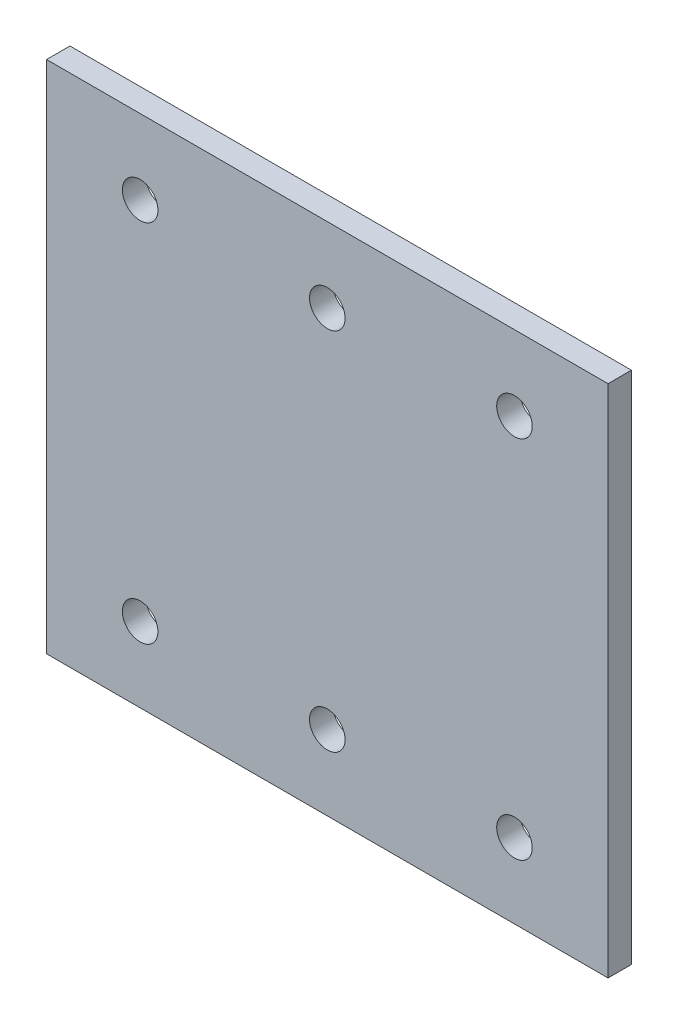
ISO-10303-21;
HEADER;
FILE_DESCRIPTION(('STEP AP214'),'2;1');
FILE_NAME('part.step','',(''),(''),'','','');
FILE_SCHEMA(('AUTOMOTIVE_DESIGN { 1 0 10303 214 1 1 1 1 }'));
ENDSEC;
DATA;
#1=APPLICATION_CONTEXT('core data for automotive mechanical design processes');
#2=APPLICATION_PROTOCOL_DEFINITION('international standard','automotive_design',2000,#1);
#3=PRODUCT_CONTEXT('',#1,'mechanical');
#4=PRODUCT('Part','Part','',(#3));
#5=PRODUCT_RELATED_PRODUCT_CATEGORY('part','',(#4));
#6=PRODUCT_DEFINITION_FORMATION('','',#4);
#7=PRODUCT_DEFINITION_CONTEXT('part definition',#1,'design');
#8=PRODUCT_DEFINITION('design','',#6,#7);
#9=PRODUCT_DEFINITION_SHAPE('','',#8);
#10=(LENGTH_UNIT() NAMED_UNIT(*) SI_UNIT(.MILLI.,.METRE.));
#11=(NAMED_UNIT(*) PLANE_ANGLE_UNIT() SI_UNIT($,.RADIAN.));
#12=(NAMED_UNIT(*) SI_UNIT($,.STERADIAN.) SOLID_ANGLE_UNIT());
#13=UNCERTAINTY_MEASURE_WITH_UNIT(LENGTH_MEASURE(1.E-05),#10,'distance_accuracy_value','');
#14=(GEOMETRIC_REPRESENTATION_CONTEXT(3) GLOBAL_UNCERTAINTY_ASSIGNED_CONTEXT((#13)) GLOBAL_UNIT_ASSIGNED_CONTEXT((#10,
#11,#12)) REPRESENTATION_CONTEXT('',''));
#15=CARTESIAN_POINT('',(0.,0.,0.));
#16=DIRECTION('',(0.,0.,1.));
#17=DIRECTION('',(1.,0.,0.));
#18=AXIS2_PLACEMENT_3D('',#15,#16,#17);
#19=CARTESIAN_POINT('',(0.,0.,3.175));
#20=DIRECTION('',(0.,0.,-1.));
#21=DIRECTION('',(-1.,0.,0.));
#22=AXIS2_PLACEMENT_3D('',#19,#20,#21);
#23=PLANE('',#22);
#24=DIRECTION('',(0.,-1.,0.));
#25=VECTOR('',#24,1.);
#26=CARTESIAN_POINT('',(0.,0.,3.175));
#27=LINE('',#26,#25);
#28=CARTESIAN_POINT('',(0.,69.85,3.175));
#29=VERTEX_POINT('',#28);
#30=CARTESIAN_POINT('',(0.,0.,3.175));
#31=VERTEX_POINT('',#30);
#32=EDGE_CURVE('E92',#29,#31,#27,.T.);
#33=ORIENTED_EDGE('',*,*,#32,.T.);
#34=DIRECTION('',(1.,0.,0.));
#35=VECTOR('',#34,1.);
#36=CARTESIAN_POINT('',(0.,0.,3.175));
#37=LINE('',#36,#35);
#38=CARTESIAN_POINT('',(76.2,0.,3.175));
#39=VERTEX_POINT('',#38);
#40=EDGE_CURVE('E87',#31,#39,#37,.T.);
#41=ORIENTED_EDGE('',*,*,#40,.T.);
#42=DIRECTION('',(0.,1.,0.));
#43=VECTOR('',#42,1.);
#44=CARTESIAN_POINT('',(76.2,0.,3.175));
#45=LINE('',#44,#43);
#46=CARTESIAN_POINT('',(76.2,69.85,3.175));
#47=VERTEX_POINT('',#46);
#48=EDGE_CURVE('E90',#39,#47,#45,.T.);
#49=ORIENTED_EDGE('',*,*,#48,.T.);
#50=DIRECTION('',(-1.,0.,0.));
#51=VECTOR('',#50,1.);
#52=CARTESIAN_POINT('',(0.,69.85,3.175));
#53=LINE('',#52,#51);
#54=EDGE_CURVE('E57',#47,#29,#53,.T.);
#55=ORIENTED_EDGE('',*,*,#54,.T.);
#56=EDGE_LOOP('',(#33,#41,#49,#55));
#57=FACE_BOUND('',#56,.T.);
#58=CARTESIAN_POINT('',(12.7,59.69,3.175));
#59=DIRECTION('',(0.,0.,1.));
#60=DIRECTION('',(1.,0.,0.));
#61=AXIS2_PLACEMENT_3D('',#58,#59,#60);
#62=CIRCLE('',#61,2.413);
#63=CARTESIAN_POINT('',(15.113,59.69,3.175));
#64=VERTEX_POINT('',#63);
#65=EDGE_CURVE('E112',#64,#64,#62,.T.);
#66=ORIENTED_EDGE('',*,*,#65,.F.);
#67=EDGE_LOOP('',(#66));
#68=FACE_BOUND('',#67,.T.);
#69=CARTESIAN_POINT('',(38.1,59.69,3.175));
#70=DIRECTION('',(0.,0.,1.));
#71=DIRECTION('',(1.,0.,0.));
#72=AXIS2_PLACEMENT_3D('',#69,#70,#71);
#73=CIRCLE('',#72,2.41299999999999);
#74=CARTESIAN_POINT('',(40.513,59.69,3.175));
#75=VERTEX_POINT('',#74);
#76=EDGE_CURVE('E134',#75,#75,#73,.T.);
#77=ORIENTED_EDGE('',*,*,#76,.F.);
#78=EDGE_LOOP('',(#77));
#79=FACE_BOUND('',#78,.T.);
#80=CARTESIAN_POINT('',(63.5,59.69,3.175));
#81=DIRECTION('',(0.,0.,1.));
#82=DIRECTION('',(1.,0.,0.));
#83=AXIS2_PLACEMENT_3D('',#80,#81,#82);
#84=CIRCLE('',#83,2.41299999999999);
#85=CARTESIAN_POINT('',(65.913,59.69,3.175));
#86=VERTEX_POINT('',#85);
#87=EDGE_CURVE('E142',#86,#86,#84,.T.);
#88=ORIENTED_EDGE('',*,*,#87,.F.);
#89=EDGE_LOOP('',(#88));
#90=FACE_BOUND('',#89,.T.);
#91=CARTESIAN_POINT('',(63.5,10.16,3.175));
#92=DIRECTION('',(0.,0.,1.));
#93=DIRECTION('',(-1.,0.,0.));
#94=AXIS2_PLACEMENT_3D('',#91,#92,#93);
#95=CIRCLE('',#94,2.41299999999999);
#96=CARTESIAN_POINT('',(61.087,10.16,3.175));
#97=VERTEX_POINT('',#96);
#98=EDGE_CURVE('E150',#97,#97,#95,.T.);
#99=ORIENTED_EDGE('',*,*,#98,.F.);
#100=EDGE_LOOP('',(#99));
#101=FACE_BOUND('',#100,.T.);
#102=CARTESIAN_POINT('',(38.1,10.16,3.175));
#103=DIRECTION('',(0.,0.,1.));
#104=DIRECTION('',(-1.,0.,0.));
#105=AXIS2_PLACEMENT_3D('',#102,#103,#104);
#106=CIRCLE('',#105,2.41299999999999);
#107=CARTESIAN_POINT('',(35.687,10.16,3.175));
#108=VERTEX_POINT('',#107);
#109=EDGE_CURVE('E158',#108,#108,#106,.T.);
#110=ORIENTED_EDGE('',*,*,#109,.F.);
#111=EDGE_LOOP('',(#110));
#112=FACE_BOUND('',#111,.T.);
#113=CARTESIAN_POINT('',(12.7,10.16,3.175));
#114=DIRECTION('',(0.,0.,1.));
#115=DIRECTION('',(-1.,0.,0.));
#116=AXIS2_PLACEMENT_3D('',#113,#114,#115);
#117=CIRCLE('',#116,2.413);
#118=CARTESIAN_POINT('',(10.287,10.16,3.175));
#119=VERTEX_POINT('',#118);
#120=EDGE_CURVE('E166',#119,#119,#117,.T.);
#121=ORIENTED_EDGE('',*,*,#120,.F.);
#122=EDGE_LOOP('',(#121));
#123=FACE_BOUND('',#122,.T.);
#124=ADVANCED_FACE('F39',(#57,#68,#79,#90,#101,#112,#123),#23,.F.);
#125=CARTESIAN_POINT('',(0.,0.,0.));
#126=DIRECTION('',(0.,0.,-1.));
#127=DIRECTION('',(-1.,0.,0.));
#128=AXIS2_PLACEMENT_3D('',#125,#126,#127);
#129=PLANE('',#128);
#130=CARTESIAN_POINT('',(38.1,10.16,0.));
#131=DIRECTION('',(0.,0.,1.));
#132=DIRECTION('',(-1.,0.,0.));
#133=AXIS2_PLACEMENT_3D('',#130,#131,#132);
#134=CIRCLE('',#133,2.41299999999999);
#135=CARTESIAN_POINT('',(35.687,10.16,0.));
#136=VERTEX_POINT('',#135);
#137=EDGE_CURVE('E162',#136,#136,#134,.T.);
#138=ORIENTED_EDGE('',*,*,#137,.T.);
#139=EDGE_LOOP('',(#138));
#140=FACE_BOUND('',#139,.T.);
#141=CARTESIAN_POINT('',(63.5,59.69,0.));
#142=DIRECTION('',(0.,0.,1.));
#143=DIRECTION('',(1.,0.,0.));
#144=AXIS2_PLACEMENT_3D('',#141,#142,#143);
#145=CIRCLE('',#144,2.41299999999999);
#146=CARTESIAN_POINT('',(65.913,59.69,0.));
#147=VERTEX_POINT('',#146);
#148=EDGE_CURVE('E146',#147,#147,#145,.T.);
#149=ORIENTED_EDGE('',*,*,#148,.T.);
#150=EDGE_LOOP('',(#149));
#151=FACE_BOUND('',#150,.T.);
#152=CARTESIAN_POINT('',(12.7,59.69,0.));
#153=DIRECTION('',(0.,0.,1.));
#154=DIRECTION('',(1.,0.,0.));
#155=AXIS2_PLACEMENT_3D('',#152,#153,#154);
#156=CIRCLE('',#155,2.413);
#157=CARTESIAN_POINT('',(15.113,59.69,0.));
#158=VERTEX_POINT('',#157);
#159=EDGE_CURVE('E130',#158,#158,#156,.T.);
#160=ORIENTED_EDGE('',*,*,#159,.T.);
#161=EDGE_LOOP('',(#160));
#162=FACE_BOUND('',#161,.T.);
#163=DIRECTION('',(0.,-1.,0.));
#164=VECTOR('',#163,1.);
#165=CARTESIAN_POINT('',(0.,0.,0.));
#166=LINE('',#165,#164);
#167=CARTESIAN_POINT('',(0.,69.85,0.));
#168=VERTEX_POINT('',#167);
#169=CARTESIAN_POINT('',(0.,0.,0.));
#170=VERTEX_POINT('',#169);
#171=EDGE_CURVE('E108',#168,#170,#166,.T.);
#172=ORIENTED_EDGE('',*,*,#171,.F.);
#173=DIRECTION('',(-1.,0.,0.));
#174=VECTOR('',#173,1.);
#175=CARTESIAN_POINT('',(0.,69.85,0.));
#176=LINE('',#175,#174);
#177=CARTESIAN_POINT('',(76.2,69.85,0.));
#178=VERTEX_POINT('',#177);
#179=EDGE_CURVE('E80',#178,#168,#176,.T.);
#180=ORIENTED_EDGE('',*,*,#179,.F.);
#181=DIRECTION('',(0.,1.,0.));
#182=VECTOR('',#181,1.);
#183=CARTESIAN_POINT('',(76.2,0.,0.));
#184=LINE('',#183,#182);
#185=CARTESIAN_POINT('',(76.2,0.,0.));
#186=VERTEX_POINT('',#185);
#187=EDGE_CURVE('E74',#186,#178,#184,.T.);
#188=ORIENTED_EDGE('',*,*,#187,.F.);
#189=DIRECTION('',(1.,0.,0.));
#190=VECTOR('',#189,1.);
#191=CARTESIAN_POINT('',(0.,0.,0.));
#192=LINE('',#191,#190);
#193=EDGE_CURVE('E97',#170,#186,#192,.T.);
#194=ORIENTED_EDGE('',*,*,#193,.F.);
#195=EDGE_LOOP('',(#172,#180,#188,#194));
#196=FACE_BOUND('',#195,.T.);
#197=CARTESIAN_POINT('',(38.1,59.69,0.));
#198=DIRECTION('',(0.,0.,1.));
#199=DIRECTION('',(1.,0.,0.));
#200=AXIS2_PLACEMENT_3D('',#197,#198,#199);
#201=CIRCLE('',#200,2.41299999999999);
#202=CARTESIAN_POINT('',(40.513,59.69,0.));
#203=VERTEX_POINT('',#202);
#204=EDGE_CURVE('E138',#203,#203,#201,.T.);
#205=ORIENTED_EDGE('',*,*,#204,.T.);
#206=EDGE_LOOP('',(#205));
#207=FACE_BOUND('',#206,.T.);
#208=CARTESIAN_POINT('',(63.5,10.16,0.));
#209=DIRECTION('',(0.,0.,1.));
#210=DIRECTION('',(-1.,0.,0.));
#211=AXIS2_PLACEMENT_3D('',#208,#209,#210);
#212=CIRCLE('',#211,2.41299999999999);
#213=CARTESIAN_POINT('',(61.087,10.16,0.));
#214=VERTEX_POINT('',#213);
#215=EDGE_CURVE('E154',#214,#214,#212,.T.);
#216=ORIENTED_EDGE('',*,*,#215,.T.);
#217=EDGE_LOOP('',(#216));
#218=FACE_BOUND('',#217,.T.);
#219=CARTESIAN_POINT('',(12.7,10.16,0.));
#220=DIRECTION('',(0.,0.,1.));
#221=DIRECTION('',(-1.,0.,0.));
#222=AXIS2_PLACEMENT_3D('',#219,#220,#221);
#223=CIRCLE('',#222,2.413);
#224=CARTESIAN_POINT('',(10.287,10.16,0.));
#225=VERTEX_POINT('',#224);
#226=EDGE_CURVE('E170',#225,#225,#223,.T.);
#227=ORIENTED_EDGE('',*,*,#226,.T.);
#228=EDGE_LOOP('',(#227));
#229=FACE_BOUND('',#228,.T.);
#230=ADVANCED_FACE('F125',(#140,#151,#162,#196,#207,#218,#229),#129,.T.);
#231=CARTESIAN_POINT('',(0.,0.,3.175));
#232=DIRECTION('',(1.,0.,0.));
#233=DIRECTION('',(0.,0.,-1.));
#234=AXIS2_PLACEMENT_3D('',#231,#232,#233);
#235=PLANE('',#234);
#236=ORIENTED_EDGE('',*,*,#171,.T.);
#237=DIRECTION('',(0.,0.,-1.));
#238=VECTOR('',#237,1.);
#239=CARTESIAN_POINT('',(0.,0.,3.175));
#240=LINE('',#239,#238);
#241=EDGE_CURVE('E11',#31,#170,#240,.T.);
#242=ORIENTED_EDGE('',*,*,#241,.F.);
#243=ORIENTED_EDGE('',*,*,#32,.F.);
#244=DIRECTION('',(0.,0.,-1.));
#245=VECTOR('',#244,1.);
#246=CARTESIAN_POINT('',(0.,69.85,3.175));
#247=LINE('',#246,#245);
#248=EDGE_CURVE('E104',#29,#168,#247,.T.);
#249=ORIENTED_EDGE('',*,*,#248,.T.);
#250=EDGE_LOOP('',(#236,#242,#243,#249));
#251=FACE_BOUND('',#250,.T.);
#252=ADVANCED_FACE('F41',(#251),#235,.F.);
#253=CARTESIAN_POINT('',(0.,0.,3.175));
#254=DIRECTION('',(0.,1.,0.));
#255=DIRECTION('',(0.,0.,1.));
#256=AXIS2_PLACEMENT_3D('',#253,#254,#255);
#257=PLANE('',#256);
#258=ORIENTED_EDGE('',*,*,#193,.T.);
#259=DIRECTION('',(0.,0.,-1.));
#260=VECTOR('',#259,1.);
#261=CARTESIAN_POINT('',(76.2,0.,3.175));
#262=LINE('',#261,#260);
#263=EDGE_CURVE('E49',#39,#186,#262,.T.);
#264=ORIENTED_EDGE('',*,*,#263,.F.);
#265=ORIENTED_EDGE('',*,*,#40,.F.);
#266=ORIENTED_EDGE('',*,*,#241,.T.);
#267=EDGE_LOOP('',(#258,#264,#265,#266));
#268=FACE_BOUND('',#267,.T.);
#269=ADVANCED_FACE('F96',(#268),#257,.F.);
#270=CARTESIAN_POINT('',(76.2,0.,3.175));
#271=DIRECTION('',(-1.,0.,0.));
#272=DIRECTION('',(0.,0.,1.));
#273=AXIS2_PLACEMENT_3D('',#270,#271,#272);
#274=PLANE('',#273);
#275=ORIENTED_EDGE('',*,*,#187,.T.);
#276=DIRECTION('',(0.,0.,-1.));
#277=VECTOR('',#276,1.);
#278=CARTESIAN_POINT('',(76.2,69.85,3.175));
#279=LINE('',#278,#277);
#280=EDGE_CURVE('E99',#47,#178,#279,.T.);
#281=ORIENTED_EDGE('',*,*,#280,.F.);
#282=ORIENTED_EDGE('',*,*,#48,.F.);
#283=ORIENTED_EDGE('',*,*,#263,.T.);
#284=EDGE_LOOP('',(#275,#281,#282,#283));
#285=FACE_BOUND('',#284,.T.);
#286=ADVANCED_FACE('F100',(#285),#274,.F.);
#287=CARTESIAN_POINT('',(0.,69.85,3.175));
#288=DIRECTION('',(0.,-1.,0.));
#289=DIRECTION('',(0.,0.,-1.));
#290=AXIS2_PLACEMENT_3D('',#287,#288,#289);
#291=PLANE('',#290);
#292=ORIENTED_EDGE('',*,*,#179,.T.);
#293=ORIENTED_EDGE('',*,*,#248,.F.);
#294=ORIENTED_EDGE('',*,*,#54,.F.);
#295=ORIENTED_EDGE('',*,*,#280,.T.);
#296=EDGE_LOOP('',(#292,#293,#294,#295));
#297=FACE_BOUND('',#296,.T.);
#298=ADVANCED_FACE('F122',(#297),#291,.F.);
#299=CARTESIAN_POINT('',(12.7,59.69,3.175));
#300=DIRECTION('',(0.,0.,-1.));
#301=DIRECTION('',(-1.,0.,0.));
#302=AXIS2_PLACEMENT_3D('',#299,#300,#301);
#303=CYLINDRICAL_SURFACE('',#302,2.413);
#304=ORIENTED_EDGE('',*,*,#65,.T.);
#305=EDGE_LOOP('',(#304));
#306=FACE_BOUND('',#305,.T.);
#307=ORIENTED_EDGE('',*,*,#159,.F.);
#308=EDGE_LOOP('',(#307));
#309=FACE_BOUND('',#308,.T.);
#310=ADVANCED_FACE('F189',(#306,#309),#303,.F.);
#311=CARTESIAN_POINT('',(38.1,59.69,3.175));
#312=DIRECTION('',(0.,0.,-1.));
#313=DIRECTION('',(-1.,0.,0.));
#314=AXIS2_PLACEMENT_3D('',#311,#312,#313);
#315=CYLINDRICAL_SURFACE('',#314,2.41299999999999);
#316=ORIENTED_EDGE('',*,*,#76,.T.);
#317=EDGE_LOOP('',(#316));
#318=FACE_BOUND('',#317,.T.);
#319=ORIENTED_EDGE('',*,*,#204,.F.);
#320=EDGE_LOOP('',(#319));
#321=FACE_BOUND('',#320,.T.);
#322=ADVANCED_FACE('F235',(#318,#321),#315,.F.);
#323=CARTESIAN_POINT('',(63.5,59.69,3.175));
#324=DIRECTION('',(0.,0.,-1.));
#325=DIRECTION('',(-1.,0.,0.));
#326=AXIS2_PLACEMENT_3D('',#323,#324,#325);
#327=CYLINDRICAL_SURFACE('',#326,2.41299999999999);
#328=ORIENTED_EDGE('',*,*,#87,.T.);
#329=EDGE_LOOP('',(#328));
#330=FACE_BOUND('',#329,.T.);
#331=ORIENTED_EDGE('',*,*,#148,.F.);
#332=EDGE_LOOP('',(#331));
#333=FACE_BOUND('',#332,.T.);
#334=ADVANCED_FACE('F243',(#330,#333),#327,.F.);
#335=CARTESIAN_POINT('',(63.5,10.16,3.175));
#336=DIRECTION('',(0.,0.,-1.));
#337=DIRECTION('',(-1.,0.,0.));
#338=AXIS2_PLACEMENT_3D('',#335,#336,#337);
#339=CYLINDRICAL_SURFACE('',#338,2.41299999999999);
#340=ORIENTED_EDGE('',*,*,#98,.T.);
#341=EDGE_LOOP('',(#340));
#342=FACE_BOUND('',#341,.T.);
#343=ORIENTED_EDGE('',*,*,#215,.F.);
#344=EDGE_LOOP('',(#343));
#345=FACE_BOUND('',#344,.T.);
#346=ADVANCED_FACE('F251',(#342,#345),#339,.F.);
#347=CARTESIAN_POINT('',(38.1,10.16,3.175));
#348=DIRECTION('',(0.,0.,-1.));
#349=DIRECTION('',(-1.,0.,0.));
#350=AXIS2_PLACEMENT_3D('',#347,#348,#349);
#351=CYLINDRICAL_SURFACE('',#350,2.41299999999999);
#352=ORIENTED_EDGE('',*,*,#109,.T.);
#353=EDGE_LOOP('',(#352));
#354=FACE_BOUND('',#353,.T.);
#355=ORIENTED_EDGE('',*,*,#137,.F.);
#356=EDGE_LOOP('',(#355));
#357=FACE_BOUND('',#356,.T.);
#358=ADVANCED_FACE('F260',(#354,#357),#351,.F.);
#359=CARTESIAN_POINT('',(12.7,10.16,3.175));
#360=DIRECTION('',(0.,0.,-1.));
#361=DIRECTION('',(-1.,0.,0.));
#362=AXIS2_PLACEMENT_3D('',#359,#360,#361);
#363=CYLINDRICAL_SURFACE('',#362,2.413);
#364=ORIENTED_EDGE('',*,*,#120,.T.);
#365=EDGE_LOOP('',(#364));
#366=FACE_BOUND('',#365,.T.);
#367=ORIENTED_EDGE('',*,*,#226,.F.);
#368=EDGE_LOOP('',(#367));
#369=FACE_BOUND('',#368,.T.);
#370=ADVANCED_FACE('F178',(#366,#369),#363,.F.);
#371=CLOSED_SHELL('',(#124,#230,#252,#269,#286,#298,#310,#322,#334,#346,#358,#370));
#372=MANIFOLD_SOLID_BREP('B2',#371);
#373=ADVANCED_BREP_SHAPE_REPRESENTATION('',(#18,#372),#14);
#374=SHAPE_DEFINITION_REPRESENTATION(#9,#373);
ENDSEC;
END-ISO-10303-21;
